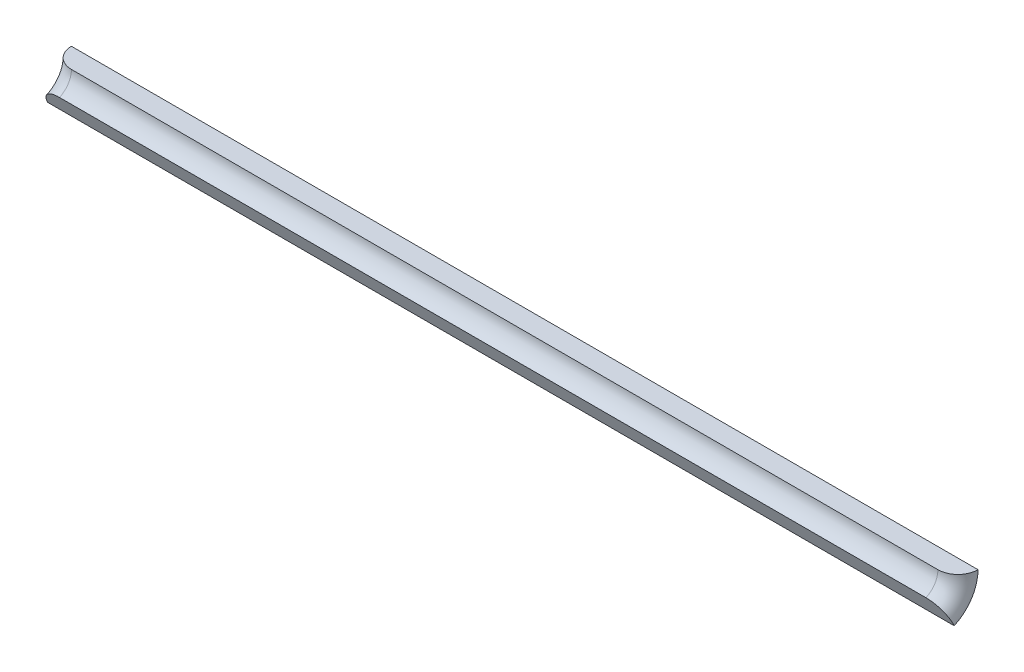
ISO-10303-21;
HEADER;
FILE_DESCRIPTION(('STEP AP214'),'2;1');
FILE_NAME('part.step','',(''),(''),'','','');
FILE_SCHEMA(('AUTOMOTIVE_DESIGN { 1 0 10303 214 1 1 1 1 }'));
ENDSEC;
DATA;
#1=APPLICATION_CONTEXT('core data for automotive mechanical design processes');
#2=APPLICATION_PROTOCOL_DEFINITION('international standard','automotive_design',2000,#1);
#3=PRODUCT_CONTEXT('',#1,'mechanical');
#4=PRODUCT('Part','Part','',(#3));
#5=PRODUCT_RELATED_PRODUCT_CATEGORY('part','',(#4));
#6=PRODUCT_DEFINITION_FORMATION('','',#4);
#7=PRODUCT_DEFINITION_CONTEXT('part definition',#1,'design');
#8=PRODUCT_DEFINITION('design','',#6,#7);
#9=PRODUCT_DEFINITION_SHAPE('','',#8);
#10=(LENGTH_UNIT() NAMED_UNIT(*) SI_UNIT(.MILLI.,.METRE.));
#11=(NAMED_UNIT(*) PLANE_ANGLE_UNIT() SI_UNIT($,.RADIAN.));
#12=(NAMED_UNIT(*) SI_UNIT($,.STERADIAN.) SOLID_ANGLE_UNIT());
#13=UNCERTAINTY_MEASURE_WITH_UNIT(LENGTH_MEASURE(1.E-05),#10,'distance_accuracy_value','');
#14=(GEOMETRIC_REPRESENTATION_CONTEXT(3) GLOBAL_UNCERTAINTY_ASSIGNED_CONTEXT((#13)) GLOBAL_UNIT_ASSIGNED_CONTEXT((#10,
#11,#12)) REPRESENTATION_CONTEXT('',''));
#15=CARTESIAN_POINT('',(0.,0.,0.));
#16=DIRECTION('',(0.,0.,1.));
#17=DIRECTION('',(1.,0.,0.));
#18=AXIS2_PLACEMENT_3D('',#15,#16,#17);
#19=CARTESIAN_POINT('',(0.,-52.9000574469563,6.));
#20=DIRECTION('',(1.,0.,0.));
#21=DIRECTION('',(0.,0.,-1.));
#22=AXIS2_PLACEMENT_3D('',#19,#20,#21);
#23=CYLINDRICAL_SURFACE('',#22,6.);
#24=DIRECTION('',(1.,0.,0.));
#25=VECTOR('',#24,1.);
#26=CARTESIAN_POINT('',(0.,-52.9000574469563,0.));
#27=LINE('',#26,#25);
#28=CARTESIAN_POINT('',(-67.8,-52.9000574469563,0.));
#29=VERTEX_POINT('',#28);
#30=CARTESIAN_POINT('',(67.8,-52.9000574469563,0.));
#31=VERTEX_POINT('',#30);
#32=EDGE_CURVE('E40',#29,#31,#27,.T.);
#33=ORIENTED_EDGE('',*,*,#32,.T.);
#34=CARTESIAN_POINT('',(67.8,-52.9000574469563,6.));
#35=DIRECTION('',(-1.,0.,0.));
#36=DIRECTION('',(0.,0.,1.));
#37=AXIS2_PLACEMENT_3D('',#34,#35,#36);
#38=CIRCLE('',#37,6.);
#39=CARTESIAN_POINT('',(67.8,-58.3832959061152,3.56399999999999));
#40=VERTEX_POINT('',#39);
#41=EDGE_CURVE('E79',#40,#31,#38,.F.);
#42=ORIENTED_EDGE('',*,*,#41,.F.);
#43=DIRECTION('',(1.,0.,0.));
#44=VECTOR('',#43,1.);
#45=CARTESIAN_POINT('',(67.8,-58.3832959061152,3.56399999999998));
#46=LINE('',#45,#44);
#47=CARTESIAN_POINT('',(-67.8,-58.3832959061152,3.56399999999999));
#48=VERTEX_POINT('',#47);
#49=EDGE_CURVE('E11',#40,#48,#46,.F.);
#50=ORIENTED_EDGE('',*,*,#49,.T.);
#51=CARTESIAN_POINT('',(-67.8,-52.9000574469563,6.));
#52=DIRECTION('',(1.,0.,0.));
#53=DIRECTION('',(0.,1.,0.));
#54=AXIS2_PLACEMENT_3D('',#51,#52,#53);
#55=CIRCLE('',#54,6.);
#56=EDGE_CURVE('E78',#29,#48,#55,.F.);
#57=ORIENTED_EDGE('',*,*,#56,.F.);
#58=EDGE_LOOP('',(#33,#42,#50,#57));
#59=FACE_BOUND('',#58,.T.);
#60=ADVANCED_FACE('F37',(#59),#23,.T.);
#61=CARTESIAN_POINT('',(422.456236310057,-58.3832959061152,3.56399999999999));
#62=DIRECTION('',(0.,0.406000000000001,-0.913873076526494));
#63=DIRECTION('',(0.,0.913873076526494,0.406000000000001));
#64=AXIS2_PLACEMENT_3D('',#61,#62,#63);
#65=PLANE('',#64);
#66=ORIENTED_EDGE('',*,*,#49,.F.);
#67=CARTESIAN_POINT('',(64.8,-58.3832959061152,3.56399999999999));
#68=DIRECTION('',(0.,0.406000000000001,-0.913873076526494));
#69=DIRECTION('',(0.,0.913873076526494,0.406000000000001));
#70=AXIS2_PLACEMENT_3D('',#67,#68,#69);
#71=CIRCLE('',#70,3.);
#72=CARTESIAN_POINT('',(64.8,-55.6416766765357,4.78199999999999));
#73=VERTEX_POINT('',#72);
#74=EDGE_CURVE('E105',#73,#40,#71,.T.);
#75=ORIENTED_EDGE('',*,*,#74,.F.);
#76=DIRECTION('',(1.,0.,0.));
#77=VECTOR('',#76,1.);
#78=CARTESIAN_POINT('',(67.8,-55.6416766765357,4.78199999999999));
#79=LINE('',#78,#77);
#80=CARTESIAN_POINT('',(-64.8,-55.6416766765357,4.78199999999999));
#81=VERTEX_POINT('',#80);
#82=EDGE_CURVE('E95',#73,#81,#79,.F.);
#83=ORIENTED_EDGE('',*,*,#82,.T.);
#84=CARTESIAN_POINT('',(-64.8,-58.3832959061152,3.56399999999999));
#85=DIRECTION('',(0.,0.406000000000001,-0.913873076526494));
#86=DIRECTION('',(0.,0.913873076526494,0.406000000000001));
#87=AXIS2_PLACEMENT_3D('',#84,#85,#86);
#88=CIRCLE('',#87,3.);
#89=EDGE_CURVE('E88',#81,#48,#88,.F.);
#90=ORIENTED_EDGE('',*,*,#89,.T.);
#91=EDGE_LOOP('',(#66,#75,#83,#90));
#92=FACE_BOUND('',#91,.T.);
#93=ADVANCED_FACE('F93',(#92),#65,.F.);
#94=CARTESIAN_POINT('',(422.456236310057,-52.9000574469563,3.));
#95=DIRECTION('',(0.,-1.,0.));
#96=DIRECTION('',(0.,0.,-1.));
#97=AXIS2_PLACEMENT_3D('',#94,#95,#96);
#98=PLANE('',#97);
#99=DIRECTION('',(1.,0.,0.));
#100=VECTOR('',#99,1.);
#101=CARTESIAN_POINT('',(0.,-52.9000574469563,3.));
#102=LINE('',#101,#100);
#103=CARTESIAN_POINT('',(-64.8,-52.9000574469563,3.));
#104=VERTEX_POINT('',#103);
#105=CARTESIAN_POINT('',(64.8,-52.9000574469563,3.));
#106=VERTEX_POINT('',#105);
#107=EDGE_CURVE('E58',#104,#106,#102,.T.);
#108=ORIENTED_EDGE('',*,*,#107,.T.);
#109=CARTESIAN_POINT('',(64.8,-52.9000574469563,0.));
#110=DIRECTION('',(0.,-1.,0.));
#111=DIRECTION('',(0.,0.,-1.));
#112=AXIS2_PLACEMENT_3D('',#109,#110,#111);
#113=CIRCLE('',#112,3.);
#114=EDGE_CURVE('E51',#31,#106,#113,.T.);
#115=ORIENTED_EDGE('',*,*,#114,.F.);
#116=ORIENTED_EDGE('',*,*,#32,.F.);
#117=CARTESIAN_POINT('',(-64.8,-52.9000574469563,0.));
#118=DIRECTION('',(0.,-1.,0.));
#119=DIRECTION('',(0.,0.,-1.));
#120=AXIS2_PLACEMENT_3D('',#117,#118,#119);
#121=CIRCLE('',#120,3.);
#122=EDGE_CURVE('E91',#104,#29,#121,.T.);
#123=ORIENTED_EDGE('',*,*,#122,.F.);
#124=EDGE_LOOP('',(#108,#115,#116,#123));
#125=FACE_BOUND('',#124,.T.);
#126=ADVANCED_FACE('F111',(#125),#98,.F.);
#127=CARTESIAN_POINT('',(64.8,-52.9000574469563,6.));
#128=DIRECTION('',(-1.,0.,0.));
#129=DIRECTION('',(0.,0.,1.));
#130=AXIS2_PLACEMENT_3D('',#127,#128,#129);
#131=TOROIDAL_SURFACE('',#130,6.,3.);
#132=ORIENTED_EDGE('',*,*,#41,.T.);
#133=ORIENTED_EDGE('',*,*,#114,.T.);
#134=CARTESIAN_POINT('',(64.8,-52.9000574469563,6.));
#135=DIRECTION('',(-1.,0.,0.));
#136=DIRECTION('',(0.,0.,1.));
#137=AXIS2_PLACEMENT_3D('',#134,#135,#136);
#138=CIRCLE('',#137,3.);
#139=EDGE_CURVE('E103',#73,#106,#138,.F.);
#140=ORIENTED_EDGE('',*,*,#139,.F.);
#141=ORIENTED_EDGE('',*,*,#74,.T.);
#142=EDGE_LOOP('',(#132,#133,#140,#141));
#143=FACE_BOUND('',#142,.T.);
#144=ADVANCED_FACE('F107',(#143),#131,.T.);
#145=CARTESIAN_POINT('',(0.,-52.9000574469563,6.));
#146=DIRECTION('',(1.,0.,0.));
#147=DIRECTION('',(0.,0.,-1.));
#148=AXIS2_PLACEMENT_3D('',#145,#146,#147);
#149=CYLINDRICAL_SURFACE('',#148,3.);
#150=ORIENTED_EDGE('',*,*,#139,.T.);
#151=ORIENTED_EDGE('',*,*,#107,.F.);
#152=CARTESIAN_POINT('',(-64.8,-52.9000574469563,6.));
#153=DIRECTION('',(1.,0.,0.));
#154=DIRECTION('',(0.,1.,0.));
#155=AXIS2_PLACEMENT_3D('',#152,#153,#154);
#156=CIRCLE('',#155,3.);
#157=EDGE_CURVE('E96',#81,#104,#156,.T.);
#158=ORIENTED_EDGE('',*,*,#157,.F.);
#159=ORIENTED_EDGE('',*,*,#82,.F.);
#160=EDGE_LOOP('',(#150,#151,#158,#159));
#161=FACE_BOUND('',#160,.T.);
#162=ADVANCED_FACE('F108',(#161),#149,.F.);
#163=CARTESIAN_POINT('',(-64.8,-52.9000574469563,6.));
#164=DIRECTION('',(1.,0.,0.));
#165=DIRECTION('',(0.,1.,0.));
#166=AXIS2_PLACEMENT_3D('',#163,#164,#165);
#167=TOROIDAL_SURFACE('',#166,6.,3.);
#168=ORIENTED_EDGE('',*,*,#122,.T.);
#169=ORIENTED_EDGE('',*,*,#56,.T.);
#170=ORIENTED_EDGE('',*,*,#89,.F.);
#171=ORIENTED_EDGE('',*,*,#157,.T.);
#172=EDGE_LOOP('',(#168,#169,#170,#171));
#173=FACE_BOUND('',#172,.T.);
#174=ADVANCED_FACE('F87',(#173),#167,.T.);
#175=CLOSED_SHELL('',(#60,#93,#126,#144,#162,#174));
#176=MANIFOLD_SOLID_BREP('B2',#175);
#177=ADVANCED_BREP_SHAPE_REPRESENTATION('',(#18,#176),#14);
#178=SHAPE_DEFINITION_REPRESENTATION(#9,#177);
ENDSEC;
END-ISO-10303-21;
